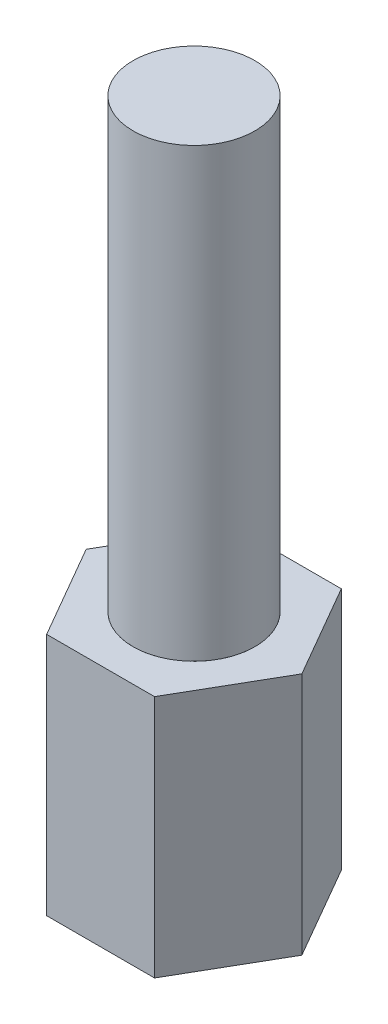
ISO-10303-21;
HEADER;
FILE_DESCRIPTION(('STEP AP214'),'2;1');
FILE_NAME('part.step','',(''),(''),'','','');
FILE_SCHEMA(('AUTOMOTIVE_DESIGN { 1 0 10303 214 1 1 1 1 }'));
ENDSEC;
DATA;
#1=APPLICATION_CONTEXT('core data for automotive mechanical design processes');
#2=APPLICATION_PROTOCOL_DEFINITION('international standard','automotive_design',2000,#1);
#3=PRODUCT_CONTEXT('',#1,'mechanical');
#4=PRODUCT('Part','Part','',(#3));
#5=PRODUCT_RELATED_PRODUCT_CATEGORY('part','',(#4));
#6=PRODUCT_DEFINITION_FORMATION('','',#4);
#7=PRODUCT_DEFINITION_CONTEXT('part definition',#1,'design');
#8=PRODUCT_DEFINITION('design','',#6,#7);
#9=PRODUCT_DEFINITION_SHAPE('','',#8);
#10=(LENGTH_UNIT() NAMED_UNIT(*) SI_UNIT(.MILLI.,.METRE.));
#11=(NAMED_UNIT(*) PLANE_ANGLE_UNIT() SI_UNIT($,.RADIAN.));
#12=(NAMED_UNIT(*) SI_UNIT($,.STERADIAN.) SOLID_ANGLE_UNIT());
#13=UNCERTAINTY_MEASURE_WITH_UNIT(LENGTH_MEASURE(1.E-05),#10,'distance_accuracy_value','');
#14=(GEOMETRIC_REPRESENTATION_CONTEXT(3) GLOBAL_UNCERTAINTY_ASSIGNED_CONTEXT((#13)) GLOBAL_UNIT_ASSIGNED_CONTEXT((#10,
#11,#12)) REPRESENTATION_CONTEXT('',''));
#15=CARTESIAN_POINT('',(0.,0.,0.));
#16=DIRECTION('',(0.,0.,1.));
#17=DIRECTION('',(1.,0.,0.));
#18=AXIS2_PLACEMENT_3D('',#15,#16,#17);
#19=CARTESIAN_POINT('',(1.32790561913614,6.,-2.3));
#20=DIRECTION('',(0.,0.,1.));
#21=DIRECTION('',(1.,0.,0.));
#22=AXIS2_PLACEMENT_3D('',#19,#20,#21);
#23=PLANE('',#22);
#24=DIRECTION('',(-1.,0.,0.));
#25=VECTOR('',#24,1.);
#26=CARTESIAN_POINT('',(1.32790561913614,0.,-2.3));
#27=LINE('',#26,#25);
#28=CARTESIAN_POINT('',(1.32790561913614,0.,-2.3));
#29=VERTEX_POINT('',#28);
#30=CARTESIAN_POINT('',(-1.32790561913614,0.,-2.3));
#31=VERTEX_POINT('',#30);
#32=EDGE_CURVE('E139',#29,#31,#27,.T.);
#33=ORIENTED_EDGE('',*,*,#32,.T.);
#34=DIRECTION('',(0.,-1.,0.));
#35=VECTOR('',#34,1.);
#36=CARTESIAN_POINT('',(-1.32790561913614,6.,-2.3));
#37=LINE('',#36,#35);
#38=CARTESIAN_POINT('',(-1.32790561913614,6.,-2.3));
#39=VERTEX_POINT('',#38);
#40=EDGE_CURVE('E123',#39,#31,#37,.T.);
#41=ORIENTED_EDGE('',*,*,#40,.F.);
#42=DIRECTION('',(-1.,0.,0.));
#43=VECTOR('',#42,1.);
#44=CARTESIAN_POINT('',(1.32790561913614,6.,-2.3));
#45=LINE('',#44,#43);
#46=CARTESIAN_POINT('',(1.32790561913614,6.,-2.3));
#47=VERTEX_POINT('',#46);
#48=EDGE_CURVE('E148',#47,#39,#45,.T.);
#49=ORIENTED_EDGE('',*,*,#48,.F.);
#50=DIRECTION('',(0.,-1.,0.));
#51=VECTOR('',#50,1.);
#52=CARTESIAN_POINT('',(1.32790561913614,6.,-2.3));
#53=LINE('',#52,#51);
#54=EDGE_CURVE('E125',#47,#29,#53,.T.);
#55=ORIENTED_EDGE('',*,*,#54,.T.);
#56=EDGE_LOOP('',(#33,#41,#49,#55));
#57=FACE_BOUND('',#56,.T.);
#58=ADVANCED_FACE('F55',(#57),#23,.F.);
#59=CARTESIAN_POINT('',(-1.32790561913614,6.,-2.3));
#60=DIRECTION('',(0.866025403784439,0.,0.499999999999999));
#61=DIRECTION('',(0.5,0.,-0.866025403784439));
#62=AXIS2_PLACEMENT_3D('',#59,#60,#61);
#63=PLANE('',#62);
#64=DIRECTION('',(-0.5,0.,0.866025403784439));
#65=VECTOR('',#64,1.);
#66=CARTESIAN_POINT('',(-1.32790561913614,0.,-2.3));
#67=LINE('',#66,#65);
#68=CARTESIAN_POINT('',(-2.65581123827228,0.,0.));
#69=VERTEX_POINT('',#68);
#70=EDGE_CURVE('E73',#31,#69,#67,.T.);
#71=ORIENTED_EDGE('',*,*,#70,.T.);
#72=DIRECTION('',(0.,-1.,0.));
#73=VECTOR('',#72,1.);
#74=CARTESIAN_POINT('',(-2.65581123827228,6.,0.));
#75=LINE('',#74,#73);
#76=CARTESIAN_POINT('',(-2.65581123827228,6.,0.));
#77=VERTEX_POINT('',#76);
#78=EDGE_CURVE('E120',#77,#69,#75,.T.);
#79=ORIENTED_EDGE('',*,*,#78,.F.);
#80=DIRECTION('',(-0.5,0.,0.866025403784439));
#81=VECTOR('',#80,1.);
#82=CARTESIAN_POINT('',(-1.32790561913614,6.,-2.3));
#83=LINE('',#82,#81);
#84=EDGE_CURVE('E95',#39,#77,#83,.T.);
#85=ORIENTED_EDGE('',*,*,#84,.F.);
#86=ORIENTED_EDGE('',*,*,#40,.T.);
#87=EDGE_LOOP('',(#71,#79,#85,#86));
#88=FACE_BOUND('',#87,.T.);
#89=ADVANCED_FACE('F119',(#88),#63,.F.);
#90=CARTESIAN_POINT('',(-2.65581123827228,6.,0.));
#91=DIRECTION('',(0.866025403784439,0.,-0.5));
#92=DIRECTION('',(-0.5,0.,-0.866025403784439));
#93=AXIS2_PLACEMENT_3D('',#90,#91,#92);
#94=PLANE('',#93);
#95=DIRECTION('',(0.5,0.,0.866025403784438));
#96=VECTOR('',#95,1.);
#97=CARTESIAN_POINT('',(-2.65581123827228,0.,0.));
#98=LINE('',#97,#96);
#99=CARTESIAN_POINT('',(-1.32790561913614,0.,2.3));
#100=VERTEX_POINT('',#99);
#101=EDGE_CURVE('E116',#69,#100,#98,.T.);
#102=ORIENTED_EDGE('',*,*,#101,.T.);
#103=DIRECTION('',(0.,-1.,0.));
#104=VECTOR('',#103,1.);
#105=CARTESIAN_POINT('',(-1.32790561913614,6.,2.3));
#106=LINE('',#105,#104);
#107=CARTESIAN_POINT('',(-1.32790561913614,6.,2.3));
#108=VERTEX_POINT('',#107);
#109=EDGE_CURVE('E163',#108,#100,#106,.T.);
#110=ORIENTED_EDGE('',*,*,#109,.F.);
#111=DIRECTION('',(0.5,0.,0.866025403784438));
#112=VECTOR('',#111,1.);
#113=CARTESIAN_POINT('',(-2.65581123827228,6.,0.));
#114=LINE('',#113,#112);
#115=EDGE_CURVE('E128',#77,#108,#114,.T.);
#116=ORIENTED_EDGE('',*,*,#115,.F.);
#117=ORIENTED_EDGE('',*,*,#78,.T.);
#118=EDGE_LOOP('',(#102,#110,#116,#117));
#119=FACE_BOUND('',#118,.T.);
#120=ADVANCED_FACE('F127',(#119),#94,.F.);
#121=CARTESIAN_POINT('',(-1.32790561913614,6.,2.3));
#122=DIRECTION('',(0.,0.,-1.));
#123=DIRECTION('',(-1.,0.,0.));
#124=AXIS2_PLACEMENT_3D('',#121,#122,#123);
#125=PLANE('',#124);
#126=DIRECTION('',(1.,0.,0.));
#127=VECTOR('',#126,1.);
#128=CARTESIAN_POINT('',(-1.32790561913614,0.,2.3));
#129=LINE('',#128,#127);
#130=CARTESIAN_POINT('',(1.32790561913614,0.,2.3));
#131=VERTEX_POINT('',#130);
#132=EDGE_CURVE('E129',#100,#131,#129,.T.);
#133=ORIENTED_EDGE('',*,*,#132,.T.);
#134=DIRECTION('',(0.,-1.,0.));
#135=VECTOR('',#134,1.);
#136=CARTESIAN_POINT('',(1.32790561913614,6.,2.3));
#137=LINE('',#136,#135);
#138=CARTESIAN_POINT('',(1.32790561913614,6.,2.3));
#139=VERTEX_POINT('',#138);
#140=EDGE_CURVE('E157',#139,#131,#137,.T.);
#141=ORIENTED_EDGE('',*,*,#140,.F.);
#142=DIRECTION('',(1.,0.,0.));
#143=VECTOR('',#142,1.);
#144=CARTESIAN_POINT('',(-1.32790561913614,6.,2.3));
#145=LINE('',#144,#143);
#146=EDGE_CURVE('E144',#108,#139,#145,.T.);
#147=ORIENTED_EDGE('',*,*,#146,.F.);
#148=ORIENTED_EDGE('',*,*,#109,.T.);
#149=EDGE_LOOP('',(#133,#141,#147,#148));
#150=FACE_BOUND('',#149,.T.);
#151=ADVANCED_FACE('F169',(#150),#125,.F.);
#152=CARTESIAN_POINT('',(1.32790561913614,6.,2.3));
#153=DIRECTION('',(-0.866025403784439,0.,-0.5));
#154=DIRECTION('',(-0.5,0.,0.866025403784439));
#155=AXIS2_PLACEMENT_3D('',#152,#153,#154);
#156=PLANE('',#155);
#157=DIRECTION('',(0.5,0.,-0.866025403784439));
#158=VECTOR('',#157,1.);
#159=CARTESIAN_POINT('',(1.32790561913614,0.,2.3));
#160=LINE('',#159,#158);
#161=CARTESIAN_POINT('',(2.65581123827228,0.,0.));
#162=VERTEX_POINT('',#161);
#163=EDGE_CURVE('E162',#131,#162,#160,.T.);
#164=ORIENTED_EDGE('',*,*,#163,.T.);
#165=DIRECTION('',(0.,-1.,0.));
#166=VECTOR('',#165,1.);
#167=CARTESIAN_POINT('',(2.65581123827228,6.,0.));
#168=LINE('',#167,#166);
#169=CARTESIAN_POINT('',(2.65581123827228,6.,0.));
#170=VERTEX_POINT('',#169);
#171=EDGE_CURVE('E151',#170,#162,#168,.T.);
#172=ORIENTED_EDGE('',*,*,#171,.F.);
#173=DIRECTION('',(0.5,0.,-0.866025403784439));
#174=VECTOR('',#173,1.);
#175=CARTESIAN_POINT('',(1.32790561913614,6.,2.3));
#176=LINE('',#175,#174);
#177=EDGE_CURVE('E142',#139,#170,#176,.T.);
#178=ORIENTED_EDGE('',*,*,#177,.F.);
#179=ORIENTED_EDGE('',*,*,#140,.T.);
#180=EDGE_LOOP('',(#164,#172,#178,#179));
#181=FACE_BOUND('',#180,.T.);
#182=ADVANCED_FACE('F171',(#181),#156,.F.);
#183=CARTESIAN_POINT('',(2.65581123827228,6.,0.));
#184=DIRECTION('',(-0.866025403784438,0.,0.5));
#185=DIRECTION('',(0.5,0.,0.866025403784439));
#186=AXIS2_PLACEMENT_3D('',#183,#184,#185);
#187=PLANE('',#186);
#188=DIRECTION('',(-0.5,0.,-0.866025403784438));
#189=VECTOR('',#188,1.);
#190=CARTESIAN_POINT('',(2.65581123827228,0.,0.));
#191=LINE('',#190,#189);
#192=EDGE_CURVE('E104',#162,#29,#191,.T.);
#193=ORIENTED_EDGE('',*,*,#192,.T.);
#194=ORIENTED_EDGE('',*,*,#54,.F.);
#195=DIRECTION('',(-0.5,0.,-0.866025403784438));
#196=VECTOR('',#195,1.);
#197=CARTESIAN_POINT('',(2.65581123827228,6.,0.));
#198=LINE('',#197,#196);
#199=EDGE_CURVE('E65',#170,#47,#198,.T.);
#200=ORIENTED_EDGE('',*,*,#199,.F.);
#201=ORIENTED_EDGE('',*,*,#171,.T.);
#202=EDGE_LOOP('',(#193,#194,#200,#201));
#203=FACE_BOUND('',#202,.T.);
#204=ADVANCED_FACE('F173',(#203),#187,.F.);
#205=CARTESIAN_POINT('',(0.,6.,0.));
#206=DIRECTION('',(0.,1.,0.));
#207=DIRECTION('',(0.,0.,1.));
#208=AXIS2_PLACEMENT_3D('',#205,#206,#207);
#209=PLANE('',#208);
#210=CARTESIAN_POINT('',(0.,6.,0.));
#211=DIRECTION('',(0.,1.,0.));
#212=DIRECTION('',(0.,0.,1.));
#213=AXIS2_PLACEMENT_3D('',#210,#211,#212);
#214=CIRCLE('',#213,1.5);
#215=CARTESIAN_POINT('',(0.,6.,-1.5));
#216=VERTEX_POINT('',#215);
#217=EDGE_CURVE('E59',#216,#216,#214,.F.);
#218=ORIENTED_EDGE('',*,*,#217,.T.);
#219=EDGE_LOOP('',(#218));
#220=FACE_BOUND('',#219,.T.);
#221=ORIENTED_EDGE('',*,*,#48,.T.);
#222=ORIENTED_EDGE('',*,*,#84,.T.);
#223=ORIENTED_EDGE('',*,*,#115,.T.);
#224=ORIENTED_EDGE('',*,*,#146,.T.);
#225=ORIENTED_EDGE('',*,*,#177,.T.);
#226=ORIENTED_EDGE('',*,*,#199,.T.);
#227=EDGE_LOOP('',(#221,#222,#223,#224,#225,#226));
#228=FACE_BOUND('',#227,.T.);
#229=ADVANCED_FACE('F174',(#220,#228),#209,.T.);
#230=CARTESIAN_POINT('',(0.,0.,0.));
#231=DIRECTION('',(0.,1.,0.));
#232=DIRECTION('',(0.,0.,1.));
#233=AXIS2_PLACEMENT_3D('',#230,#231,#232);
#234=PLANE('',#233);
#235=CARTESIAN_POINT('',(0.,0.,0.));
#236=DIRECTION('',(0.,-1.,0.));
#237=DIRECTION('',(0.,0.,-1.));
#238=AXIS2_PLACEMENT_3D('',#235,#236,#237);
#239=CIRCLE('',#238,1.5);
#240=CARTESIAN_POINT('',(0.,0.,-1.5));
#241=VERTEX_POINT('',#240);
#242=EDGE_CURVE('E12',#241,#241,#239,.T.);
#243=ORIENTED_EDGE('',*,*,#242,.F.);
#244=EDGE_LOOP('',(#243));
#245=FACE_BOUND('',#244,.T.);
#246=ORIENTED_EDGE('',*,*,#32,.F.);
#247=ORIENTED_EDGE('',*,*,#192,.F.);
#248=ORIENTED_EDGE('',*,*,#163,.F.);
#249=ORIENTED_EDGE('',*,*,#132,.F.);
#250=ORIENTED_EDGE('',*,*,#101,.F.);
#251=ORIENTED_EDGE('',*,*,#70,.F.);
#252=EDGE_LOOP('',(#246,#247,#248,#249,#250,#251));
#253=FACE_BOUND('',#252,.T.);
#254=ADVANCED_FACE('F132',(#245,#253),#234,.F.);
#255=CARTESIAN_POINT('',(0.,10.2426406871193,0.));
#256=DIRECTION('',(0.,-1.,0.));
#257=DIRECTION('',(0.,0.,-1.));
#258=AXIS2_PLACEMENT_3D('',#255,#256,#257);
#259=CYLINDRICAL_SURFACE('',#258,1.5);
#260=CARTESIAN_POINT('',(0.,0.,-1.5));
#261=CARTESIAN_POINT('',(0.,0.0625000000000018,-1.5));
#262=CARTESIAN_POINT('',(0.,0.125000000000002,-1.5));
#263=CARTESIAN_POINT('',(0.,0.250000000000002,-1.5));
#264=CARTESIAN_POINT('',(0.,0.312500000000002,-1.5));
#265=CARTESIAN_POINT('',(0.,0.437500000000002,-1.5));
#266=CARTESIAN_POINT('',(0.,0.500000000000002,-1.5));
#267=CARTESIAN_POINT('',(0.,0.625000000000002,-1.5));
#268=CARTESIAN_POINT('',(0.,0.687500000000002,-1.5));
#269=CARTESIAN_POINT('',(0.,0.812500000000002,-1.5));
#270=CARTESIAN_POINT('',(0.,0.875000000000001,-1.5));
#271=CARTESIAN_POINT('',(0.,1.,-1.5));
#272=CARTESIAN_POINT('',(0.,1.0625,-1.5));
#273=CARTESIAN_POINT('',(0.,1.1875,-1.5));
#274=CARTESIAN_POINT('',(0.,1.25,-1.5));
#275=CARTESIAN_POINT('',(0.,1.375,-1.5));
#276=CARTESIAN_POINT('',(0.,1.4375,-1.5));
#277=CARTESIAN_POINT('',(0.,1.5625,-1.5));
#278=CARTESIAN_POINT('',(0.,1.625,-1.5));
#279=CARTESIAN_POINT('',(0.,1.75,-1.5));
#280=CARTESIAN_POINT('',(0.,1.8125,-1.5));
#281=CARTESIAN_POINT('',(0.,1.9375,-1.5));
#282=CARTESIAN_POINT('',(0.,2.,-1.5));
#283=CARTESIAN_POINT('',(0.,2.125,-1.5));
#284=CARTESIAN_POINT('',(0.,2.1875,-1.5));
#285=CARTESIAN_POINT('',(0.,2.3125,-1.5));
#286=CARTESIAN_POINT('',(0.,2.375,-1.5));
#287=CARTESIAN_POINT('',(0.,2.5,-1.5));
#288=CARTESIAN_POINT('',(0.,2.5625,-1.5));
#289=CARTESIAN_POINT('',(0.,2.6875,-1.5));
#290=CARTESIAN_POINT('',(0.,2.75,-1.5));
#291=CARTESIAN_POINT('',(0.,2.875,-1.5));
#292=CARTESIAN_POINT('',(0.,2.9375,-1.5));
#293=CARTESIAN_POINT('',(0.,3.0625,-1.5));
#294=CARTESIAN_POINT('',(0.,3.125,-1.5));
#295=CARTESIAN_POINT('',(0.,3.25,-1.5));
#296=CARTESIAN_POINT('',(0.,3.3125,-1.5));
#297=CARTESIAN_POINT('',(0.,3.4375,-1.5));
#298=CARTESIAN_POINT('',(0.,3.5,-1.5));
#299=CARTESIAN_POINT('',(0.,3.625,-1.5));
#300=CARTESIAN_POINT('',(0.,3.6875,-1.5));
#301=CARTESIAN_POINT('',(0.,3.8125,-1.5));
#302=CARTESIAN_POINT('',(0.,3.875,-1.5));
#303=CARTESIAN_POINT('',(0.,4.,-1.5));
#304=CARTESIAN_POINT('',(0.,4.0625,-1.5));
#305=CARTESIAN_POINT('',(0.,4.1875,-1.5));
#306=CARTESIAN_POINT('',(0.,4.25,-1.5));
#307=CARTESIAN_POINT('',(0.,4.375,-1.5));
#308=CARTESIAN_POINT('',(0.,4.4375,-1.5));
#309=CARTESIAN_POINT('',(0.,4.5625,-1.5));
#310=CARTESIAN_POINT('',(0.,4.625,-1.5));
#311=CARTESIAN_POINT('',(0.,4.75,-1.5));
#312=CARTESIAN_POINT('',(0.,4.8125,-1.5));
#313=CARTESIAN_POINT('',(0.,4.9375,-1.5));
#314=CARTESIAN_POINT('',(0.,5.,-1.5));
#315=CARTESIAN_POINT('',(0.,5.125,-1.5));
#316=CARTESIAN_POINT('',(0.,5.1875,-1.5));
#317=CARTESIAN_POINT('',(0.,5.3125,-1.5));
#318=CARTESIAN_POINT('',(0.,5.375,-1.5));
#319=CARTESIAN_POINT('',(0.,5.5,-1.5));
#320=CARTESIAN_POINT('',(0.,5.5625,-1.5));
#321=CARTESIAN_POINT('',(0.,5.6875,-1.5));
#322=CARTESIAN_POINT('',(0.,5.75,-1.5));
#323=CARTESIAN_POINT('',(0.,5.875,-1.5));
#324=CARTESIAN_POINT('',(0.,5.9375,-1.5));
#325=CARTESIAN_POINT('',(0.,6.,-1.5));
#326=B_SPLINE_CURVE_WITH_KNOTS('',3,(#260,#261,#262,#263,#264,#265,#266,#267,#268,#269,#270,
#271,#272,#273,#274,#275,#276,#277,#278,#279,#280,#281,#282,#283,#284,#285,#286,#287,#288,#289,
#290,#291,#292,#293,#294,#295,#296,#297,#298,#299,#300,#301,#302,#303,#304,#305,#306,#307,#308,
#309,#310,#311,#312,#313,#314,#315,#316,#317,#318,#319,#320,#321,#322,#323,#324,#325),
.UNSPECIFIED.,.F.,.F.,(4,2,2,2,2,2,2,2,2,2,2,2,2,2,2,2,2,2,2,2,2,2,2,2,2,2,2,2,2,2,2,2,4),(0.,
0.1875,0.375,0.5625,0.750000000000001,0.937499999999999,1.125,1.3125,1.5,1.6875,1.875,2.0625,
2.25,2.4375,2.625,2.8125,3.,3.1875,3.375,3.5625,3.75,3.9375,4.125,4.3125,4.5,4.6875,4.875,
5.0625,5.25,5.4375,5.625,5.8125,6.),.UNSPECIFIED.);
#327=EDGE_CURVE('BSEAM57',#241,#216,#326,.T.);
#328=ORIENTED_EDGE('',*,*,#242,.T.);
#329=ORIENTED_EDGE('',*,*,#217,.F.);
#330=ORIENTED_EDGE('',*,*,#327,.T.);
#331=ORIENTED_EDGE('',*,*,#327,.F.);
#332=EDGE_LOOP('',(#328,#330,#329,#331));
#333=FACE_BOUND('',#332,.T.);
#334=ADVANCED_FACE('F57',(#333),#259,.F.);
#335=CLOSED_SHELL('',(#58,#89,#120,#151,#182,#204,#229,#254,#334));
#336=MANIFOLD_SOLID_BREP('B2',#335);
#337=CARTESIAN_POINT('',(0.,17.,0.));
#338=DIRECTION('',(0.,1.,0.));
#339=DIRECTION('',(0.,0.,1.));
#340=AXIS2_PLACEMENT_3D('',#337,#338,#339);
#341=PLANE('',#340);
#342=CARTESIAN_POINT('',(0.,17.,0.));
#343=DIRECTION('',(0.,1.,0.));
#344=DIRECTION('',(0.,0.,1.));
#345=AXIS2_PLACEMENT_3D('',#342,#343,#344);
#346=CIRCLE('',#345,1.5);
#347=CARTESIAN_POINT('',(0.,17.,1.5));
#348=VERTEX_POINT('',#347);
#349=EDGE_CURVE('E54',#348,#348,#346,.T.);
#350=ORIENTED_EDGE('',*,*,#349,.T.);
#351=EDGE_LOOP('',(#350));
#352=FACE_BOUND('',#351,.T.);
#353=ADVANCED_FACE('F278',(#352),#341,.T.);
#354=CARTESIAN_POINT('',(0.,17.,0.));
#355=DIRECTION('',(0.,-1.,0.));
#356=DIRECTION('',(0.,0.,-1.));
#357=AXIS2_PLACEMENT_3D('',#354,#355,#356);
#358=CYLINDRICAL_SURFACE('',#357,1.5);
#359=ORIENTED_EDGE('',*,*,#349,.F.);
#360=EDGE_LOOP('',(#359));
#361=FACE_BOUND('',#360,.T.);
#362=CARTESIAN_POINT('',(0.,6.,0.));
#363=DIRECTION('',(0.,1.,0.));
#364=DIRECTION('',(0.,0.,1.));
#365=AXIS2_PLACEMENT_3D('',#362,#363,#364);
#366=CIRCLE('',#365,1.5);
#367=CARTESIAN_POINT('',(0.,6.,1.5));
#368=VERTEX_POINT('',#367);
#369=EDGE_CURVE('E285',#368,#368,#366,.F.);
#370=ORIENTED_EDGE('',*,*,#369,.F.);
#371=EDGE_LOOP('',(#370));
#372=FACE_BOUND('',#371,.T.);
#373=ADVANCED_FACE('F280',(#361,#372),#358,.T.);
#374=CARTESIAN_POINT('',(0.,6.,0.));
#375=DIRECTION('',(0.,1.,0.));
#376=DIRECTION('',(0.,0.,1.));
#377=AXIS2_PLACEMENT_3D('',#374,#375,#376);
#378=PLANE('',#377);
#379=ORIENTED_EDGE('',*,*,#369,.T.);
#380=EDGE_LOOP('',(#379));
#381=FACE_BOUND('',#380,.T.);
#382=ADVANCED_FACE('F291',(#381),#378,.F.);
#383=CLOSED_SHELL('',(#353,#373,#382));
#384=MANIFOLD_SOLID_BREP('B6',#383);
#385=ADVANCED_BREP_SHAPE_REPRESENTATION('',(#18,#336,#384),#14);
#386=SHAPE_DEFINITION_REPRESENTATION(#9,#385);
ENDSEC;
END-ISO-10303-21;
